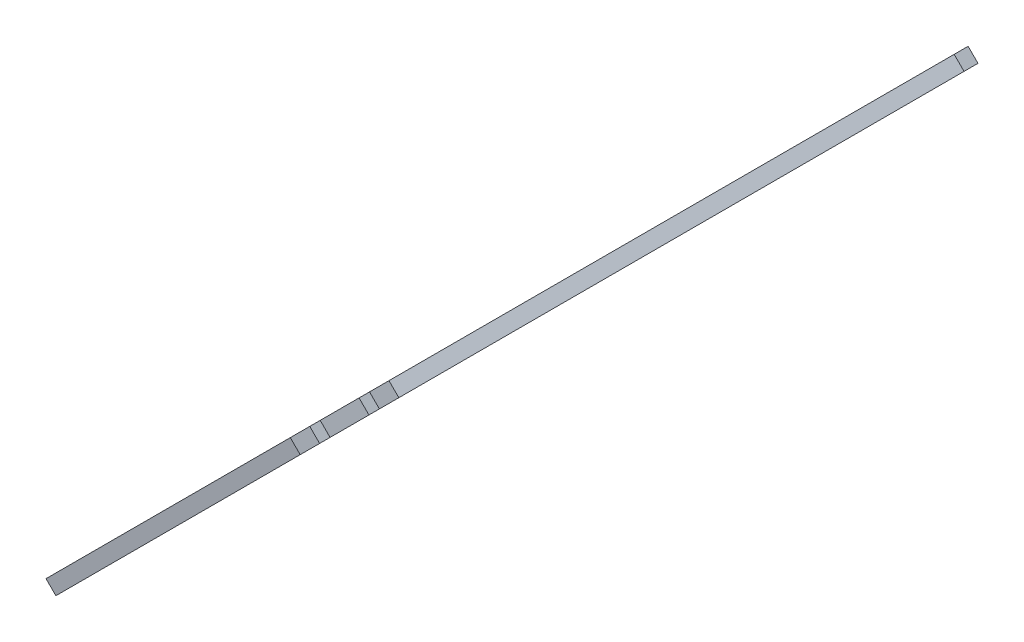
ISO-10303-21;
HEADER;
FILE_DESCRIPTION(('STEP AP214'),'2;1');
FILE_NAME('part.step','',(''),(''),'','','');
FILE_SCHEMA(('AUTOMOTIVE_DESIGN { 1 0 10303 214 1 1 1 1 }'));
ENDSEC;
DATA;
#1=APPLICATION_CONTEXT('core data for automotive mechanical design processes');
#2=APPLICATION_PROTOCOL_DEFINITION('international standard','automotive_design',2000,#1);
#3=PRODUCT_CONTEXT('',#1,'mechanical');
#4=PRODUCT('Part','Part','',(#3));
#5=PRODUCT_RELATED_PRODUCT_CATEGORY('part','',(#4));
#6=PRODUCT_DEFINITION_FORMATION('','',#4);
#7=PRODUCT_DEFINITION_CONTEXT('part definition',#1,'design');
#8=PRODUCT_DEFINITION('design','',#6,#7);
#9=PRODUCT_DEFINITION_SHAPE('','',#8);
#10=(LENGTH_UNIT() NAMED_UNIT(*) SI_UNIT(.MILLI.,.METRE.));
#11=(NAMED_UNIT(*) PLANE_ANGLE_UNIT() SI_UNIT($,.RADIAN.));
#12=(NAMED_UNIT(*) SI_UNIT($,.STERADIAN.) SOLID_ANGLE_UNIT());
#13=UNCERTAINTY_MEASURE_WITH_UNIT(LENGTH_MEASURE(1.E-05),#10,'distance_accuracy_value','');
#14=(GEOMETRIC_REPRESENTATION_CONTEXT(3) GLOBAL_UNCERTAINTY_ASSIGNED_CONTEXT((#13)) GLOBAL_UNIT_ASSIGNED_CONTEXT((#10,
#11,#12)) REPRESENTATION_CONTEXT('',''));
#15=CARTESIAN_POINT('',(0.,0.,0.));
#16=DIRECTION('',(0.,0.,1.));
#17=DIRECTION('',(1.,0.,0.));
#18=AXIS2_PLACEMENT_3D('',#15,#16,#17);
#19=CARTESIAN_POINT('',(-695.793434049919,954.082755931268,115.000000000005));
#20=DIRECTION('',(0.,0.,-1.));
#21=DIRECTION('',(0.,1.,0.));
#22=AXIS2_PLACEMENT_3D('',#19,#20,#21);
#23=PLANE('',#22);
#24=DIRECTION('',(-0.70710678118655,-0.707106781186545,0.));
#25=VECTOR('',#24,1.);
#26=CARTESIAN_POINT('',(-38.8908729652603,297.180194846605,115.000000000005));
#27=LINE('',#26,#25);
#28=CARTESIAN_POINT('',(10.3944696834426,346.465537495308,115.000000000005));
#29=VERTEX_POINT('',#28);
#30=CARTESIAN_POINT('',(-17.4655374953074,318.605530316558,115.000000000005));
#31=VERTEX_POINT('',#30);
#32=EDGE_CURVE('E284',#29,#31,#27,.T.);
#33=ORIENTED_EDGE('',*,*,#32,.T.);
#34=DIRECTION('',(-0.707106781186546,0.707106781186549,0.));
#35=VECTOR('',#34,1.);
#36=CARTESIAN_POINT('',(-17.4655374953074,318.605530316558,115.000000000005));
#37=LINE('',#36,#35);
#38=CARTESIAN_POINT('',(-10.3944696834423,311.534462504693,115.000000000005));
#39=VERTEX_POINT('',#38);
#40=EDGE_CURVE('E179',#39,#31,#37,.T.);
#41=ORIENTED_EDGE('',*,*,#40,.F.);
#42=DIRECTION('',(-0.70710678118655,-0.707106781186545,0.));
#43=VECTOR('',#42,1.);
#44=CARTESIAN_POINT('',(-31.8198051533949,290.10912703474,115.000000000005));
#45=LINE('',#44,#43);
#46=CARTESIAN_POINT('',(17.4655374953077,339.394469683442,115.000000000005));
#47=VERTEX_POINT('',#46);
#48=EDGE_CURVE('E265',#47,#39,#45,.T.);
#49=ORIENTED_EDGE('',*,*,#48,.F.);
#50=DIRECTION('',(0.707106781186545,-0.70710678118655,0.));
#51=VECTOR('',#50,1.);
#52=CARTESIAN_POINT('',(10.3944696834426,346.465537495308,115.000000000005));
#53=LINE('',#52,#51);
#54=EDGE_CURVE('E539',#29,#47,#53,.T.);
#55=ORIENTED_EDGE('',*,*,#54,.F.);
#56=EDGE_LOOP('',(#33,#41,#49,#55));
#57=FACE_BOUND('',#56,.T.);
#58=ADVANCED_FACE('F39',(#57),#23,.F.);
#59=CARTESIAN_POINT('',(31.8198051533949,367.89087296526,115.000000000005));
#60=VERTEX_POINT('',#59);
#61=CARTESIAN_POINT('',(17.88980156402,353.960869375885,115.000000000005));
#62=VERTEX_POINT('',#61);
#63=EDGE_CURVE('E277',#60,#62,#27,.T.);
#64=ORIENTED_EDGE('',*,*,#63,.T.);
#65=DIRECTION('',(-0.707106781186545,0.70710678118655,0.));
#66=VECTOR('',#65,1.);
#67=CARTESIAN_POINT('',(17.88980156402,353.960869375885,115.000000000005));
#68=LINE('',#67,#66);
#69=CARTESIAN_POINT('',(24.9608693758852,346.88980156402,115.000000000005));
#70=VERTEX_POINT('',#69);
#71=EDGE_CURVE('E194',#70,#62,#68,.T.);
#72=ORIENTED_EDGE('',*,*,#71,.F.);
#73=CARTESIAN_POINT('',(38.8908729652602,360.819805153394,115.000000000005));
#74=VERTEX_POINT('',#73);
#75=EDGE_CURVE('E261',#74,#70,#45,.T.);
#76=ORIENTED_EDGE('',*,*,#75,.F.);
#77=DIRECTION('',(0.707106781186545,-0.70710678118655,0.));
#78=VECTOR('',#77,1.);
#79=CARTESIAN_POINT('',(-625.082755931264,1024.79343404992,115.000000000005));
#80=LINE('',#79,#78);
#81=EDGE_CURVE('E271',#60,#74,#80,.T.);
#82=ORIENTED_EDGE('',*,*,#81,.F.);
#83=EDGE_LOOP('',(#64,#72,#76,#82));
#84=FACE_BOUND('',#83,.T.);
#85=ADVANCED_FACE('F384',(#84),#23,.F.);
#86=CARTESIAN_POINT('',(-334.973628896523,1314.90256108466,-10.0000000000012));
#87=DIRECTION('',(0.,0.,1.));
#88=DIRECTION('',(0.,-1.,0.));
#89=AXIS2_PLACEMENT_3D('',#86,#87,#88);
#90=PLANE('',#89);
#91=DIRECTION('',(0.70710678118655,0.707106781186545,0.));
#92=VECTOR('',#91,1.);
#93=CARTESIAN_POINT('',(321.928932188136,657.999999999999,-10.0000000000012));
#94=LINE('',#93,#92);
#95=CARTESIAN_POINT('',(-329.000000000001,7.07106781186628,-10.000000000001));
#96=VERTEX_POINT('',#95);
#97=CARTESIAN_POINT('',(-7.28319984622147,328.787867965644,-10.0000000000011));
#98=VERTEX_POINT('',#97);
#99=EDGE_CURVE('E353',#96,#98,#94,.T.);
#100=ORIENTED_EDGE('',*,*,#99,.T.);
#101=DIRECTION('',(-0.707106781186545,0.70710678118655,0.));
#102=VECTOR('',#101,1.);
#103=CARTESIAN_POINT('',(325.252334059711,-3.74766594028986,-10.000000000001));
#104=LINE('',#103,#102);
#105=CARTESIAN_POINT('',(-0.21213203435605,321.716800153779,-10.0000000000011));
#106=VERTEX_POINT('',#105);
#107=EDGE_CURVE('E220',#106,#98,#104,.T.);
#108=ORIENTED_EDGE('',*,*,#107,.F.);
#109=DIRECTION('',(0.70710678118655,0.707106781186545,0.));
#110=VECTOR('',#109,1.);
#111=CARTESIAN_POINT('',(329.000000000001,650.928932188134,-10.0000000000012));
#112=LINE('',#111,#110);
#113=CARTESIAN_POINT('',(-321.928932188136,8.32667268468867E-13,-10.000000000001));
#114=VERTEX_POINT('',#113);
#115=EDGE_CURVE('E251',#114,#106,#112,.T.);
#116=ORIENTED_EDGE('',*,*,#115,.F.);
#117=DIRECTION('',(0.707106781186545,-0.70710678118655,0.));
#118=VECTOR('',#117,1.);
#119=CARTESIAN_POINT('',(-985.90256108466,663.973628896529,-10.000000000001));
#120=LINE('',#119,#118);
#121=EDGE_CURVE('E324',#96,#114,#120,.T.);
#122=ORIENTED_EDGE('',*,*,#121,.F.);
#123=EDGE_LOOP('',(#100,#108,#116,#122));
#124=FACE_BOUND('',#123,.T.);
#125=ADVANCED_FACE('F364',(#124),#90,.F.);
#126=CARTESIAN_POINT('',(-17.8898015640197,304.039130624115,115.000000000005));
#127=VERTEX_POINT('',#126);
#128=CARTESIAN_POINT('',(-31.819805153395,290.10912703474,115.000000000005));
#129=VERTEX_POINT('',#128);
#130=EDGE_CURVE('E260',#127,#129,#45,.T.);
#131=ORIENTED_EDGE('',*,*,#130,.F.);
#132=DIRECTION('',(0.707106781186546,-0.707106781186549,0.));
#133=VECTOR('',#132,1.);
#134=CARTESIAN_POINT('',(-24.9608693758848,311.11019843598,115.000000000005));
#135=LINE('',#134,#133);
#136=CARTESIAN_POINT('',(-24.9608693758848,311.11019843598,115.000000000005));
#137=VERTEX_POINT('',#136);
#138=EDGE_CURVE('E210',#137,#127,#135,.T.);
#139=ORIENTED_EDGE('',*,*,#138,.F.);
#140=CARTESIAN_POINT('',(-38.8908729652603,297.180194846605,115.000000000005));
#141=VERTEX_POINT('',#140);
#142=EDGE_CURVE('E184',#137,#141,#27,.T.);
#143=ORIENTED_EDGE('',*,*,#142,.T.);
#144=DIRECTION('',(0.707106781186545,-0.70710678118655,0.));
#145=VECTOR('',#144,1.);
#146=CARTESIAN_POINT('',(-695.793434049919,954.082755931268,115.000000000005));
#147=LINE('',#146,#145);
#148=EDGE_CURVE('E315',#141,#129,#147,.T.);
#149=ORIENTED_EDGE('',*,*,#148,.T.);
#150=EDGE_LOOP('',(#131,#139,#143,#149));
#151=FACE_BOUND('',#150,.T.);
#152=ADVANCED_FACE('F316',(#151),#23,.F.);
#153=CARTESIAN_POINT('',(-985.90256108466,663.973628896529,-4.84926569304031E-13));
#154=DIRECTION('',(0.190845880010733,0.190845880010732,-0.962889246053698));
#155=DIRECTION('',(0.,0.98091851553698,0.194419304280023));
#156=AXIS2_PLACEMENT_3D('',#153,#154,#155);
#157=PLANE('',#156);
#158=ORIENTED_EDGE('',*,*,#148,.F.);
#159=DIRECTION('',(-0.680865515416174,-0.68086551541617,-0.269896831834206));
#160=VECTOR('',#159,1.);
#161=CARTESIAN_POINT('',(-329.000000000001,7.07106781186639,-4.45173583404306E-13));
#162=LINE('',#161,#160);
#163=CARTESIAN_POINT('',(-329.000000000002,7.07106781186628,-4.89289360674631E-13));
#164=VERTEX_POINT('',#163);
#165=EDGE_CURVE('E272',#141,#164,#162,.T.);
#166=ORIENTED_EDGE('',*,*,#165,.T.);
#167=DIRECTION('',(0.707106781186545,-0.70710678118655,0.));
#168=VECTOR('',#167,1.);
#169=CARTESIAN_POINT('',(-985.90256108466,663.973628896529,-4.84926569304031E-13));
#170=LINE('',#169,#168);
#171=CARTESIAN_POINT('',(-321.928932188136,8.32667268468867E-13,-4.89059638838123E-13));
#172=VERTEX_POINT('',#171);
#173=EDGE_CURVE('E318',#164,#172,#170,.T.);
#174=ORIENTED_EDGE('',*,*,#173,.T.);
#175=DIRECTION('',(-0.680865515416174,-0.68086551541617,-0.269896831834206));
#176=VECTOR('',#175,1.);
#177=CARTESIAN_POINT('',(-321.928932188136,8.32667268468867E-13,-5.07469850715723E-13));
#178=LINE('',#177,#176);
#179=EDGE_CURVE('E257',#129,#172,#178,.T.);
#180=ORIENTED_EDGE('',*,*,#179,.F.);
#181=EDGE_LOOP('',(#158,#166,#174,#180));
#182=FACE_BOUND('',#181,.T.);
#183=ADVANCED_FACE('F320',(#182),#157,.F.);
#184=CARTESIAN_POINT('',(-985.90256108466,663.973628896529,-10.000000000001));
#185=DIRECTION('',(0.70710678118655,0.707106781186545,0.));
#186=DIRECTION('',(-0.707106781186545,0.70710678118655,0.));
#187=AXIS2_PLACEMENT_3D('',#184,#185,#186);
#188=PLANE('',#187);
#189=ORIENTED_EDGE('',*,*,#173,.F.);
#190=DIRECTION('',(0.,0.,-1.));
#191=VECTOR('',#190,1.);
#192=CARTESIAN_POINT('',(-329.000000000001,7.07106781186628,-10.000000000001));
#193=LINE('',#192,#191);
#194=EDGE_CURVE('E276',#164,#96,#193,.T.);
#195=ORIENTED_EDGE('',*,*,#194,.T.);
#196=ORIENTED_EDGE('',*,*,#121,.T.);
#197=DIRECTION('',(0.,0.,-1.));
#198=VECTOR('',#197,1.);
#199=CARTESIAN_POINT('',(-321.928932188136,8.32667268468867E-13,-10.000000000001));
#200=LINE('',#199,#198);
#201=EDGE_CURVE('E254',#172,#114,#200,.T.);
#202=ORIENTED_EDGE('',*,*,#201,.F.);
#203=EDGE_LOOP('',(#189,#195,#196,#202));
#204=FACE_BOUND('',#203,.T.);
#205=ADVANCED_FACE('F362',(#204),#188,.F.);
#206=CARTESIAN_POINT('',(7.2831998462213,329.212132034356,-10.0000000000011));
#207=VERTEX_POINT('',#206);
#208=CARTESIAN_POINT('',(329.000000000001,650.928932188134,-10.0000000000012));
#209=VERTEX_POINT('',#208);
#210=EDGE_CURVE('E250',#207,#209,#112,.T.);
#211=ORIENTED_EDGE('',*,*,#210,.F.);
#212=DIRECTION('',(-0.707106781186545,0.70710678118655,0.));
#213=VECTOR('',#212,1.);
#214=CARTESIAN_POINT('',(332.747665940288,3.74766594028747,-10.000000000001));
#215=LINE('',#214,#213);
#216=CARTESIAN_POINT('',(0.212132034355908,336.283199846222,-10.0000000000011));
#217=VERTEX_POINT('',#216);
#218=EDGE_CURVE('E223',#207,#217,#215,.T.);
#219=ORIENTED_EDGE('',*,*,#218,.T.);
#220=CARTESIAN_POINT('',(321.928932188136,657.999999999999,-10.0000000000012));
#221=VERTEX_POINT('',#220);
#222=EDGE_CURVE('E356',#217,#221,#94,.T.);
#223=ORIENTED_EDGE('',*,*,#222,.T.);
#224=DIRECTION('',(0.707106781186545,-0.70710678118655,0.));
#225=VECTOR('',#224,1.);
#226=CARTESIAN_POINT('',(-334.973628896523,1314.90256108466,-10.0000000000012));
#227=LINE('',#226,#225);
#228=EDGE_CURVE('E326',#221,#209,#227,.T.);
#229=ORIENTED_EDGE('',*,*,#228,.T.);
#230=EDGE_LOOP('',(#211,#219,#223,#229));
#231=FACE_BOUND('',#230,.T.);
#232=ADVANCED_FACE('F375',(#231),#90,.F.);
#233=CARTESIAN_POINT('',(-334.973628896523,1314.90256108466,-1.18607136747062E-12));
#234=DIRECTION('',(-0.70710678118655,-0.707106781186545,0.));
#235=DIRECTION('',(0.707106781186545,-0.70710678118655,0.));
#236=AXIS2_PLACEMENT_3D('',#233,#234,#235);
#237=PLANE('',#236);
#238=ORIENTED_EDGE('',*,*,#228,.F.);
#239=DIRECTION('',(0.,0.,1.));
#240=VECTOR('',#239,1.);
#241=CARTESIAN_POINT('',(321.928932188136,657.999999999999,-1.17210332550212E-12));
#242=LINE('',#241,#240);
#243=CARTESIAN_POINT('',(321.928932188136,657.999999999999,-1.17210332550212E-12));
#244=VERTEX_POINT('',#243);
#245=EDGE_CURVE('E339',#221,#244,#242,.T.);
#246=ORIENTED_EDGE('',*,*,#245,.T.);
#247=DIRECTION('',(0.707106781186545,-0.70710678118655,0.));
#248=VECTOR('',#247,1.);
#249=CARTESIAN_POINT('',(-334.973628896523,1314.90256108466,-1.18607136747062E-12));
#250=LINE('',#249,#248);
#251=CARTESIAN_POINT('',(329.000000000001,650.928932188134,-1.19028381034744E-12));
#252=VERTEX_POINT('',#251);
#253=EDGE_CURVE('E285',#244,#252,#250,.T.);
#254=ORIENTED_EDGE('',*,*,#253,.T.);
#255=DIRECTION('',(0.,0.,1.));
#256=VECTOR('',#255,1.);
#257=CARTESIAN_POINT('',(329.000000000001,650.928932188134,-1.20861464888231E-12));
#258=LINE('',#257,#256);
#259=EDGE_CURVE('E268',#209,#252,#258,.T.);
#260=ORIENTED_EDGE('',*,*,#259,.F.);
#261=EDGE_LOOP('',(#238,#246,#254,#260));
#262=FACE_BOUND('',#261,.T.);
#263=ADVANCED_FACE('F337',(#262),#237,.F.);
#264=CARTESIAN_POINT('',(-625.082755931264,1024.79343404992,115.000000000005));
#265=DIRECTION('',(-0.190845880010734,-0.190845880010733,-0.962889246053697));
#266=DIRECTION('',(0.,0.980918515536979,-0.194419304280024));
#267=AXIS2_PLACEMENT_3D('',#264,#265,#266);
#268=PLANE('',#267);
#269=ORIENTED_EDGE('',*,*,#253,.F.);
#270=DIRECTION('',(-0.680865515416174,-0.680865515416169,0.269896831834208));
#271=VECTOR('',#270,1.);
#272=CARTESIAN_POINT('',(31.8198051533948,367.89087296526,115.000000000005));
#273=LINE('',#272,#271);
#274=EDGE_CURVE('E346',#244,#60,#273,.T.);
#275=ORIENTED_EDGE('',*,*,#274,.T.);
#276=ORIENTED_EDGE('',*,*,#81,.T.);
#277=DIRECTION('',(-0.680865515416174,-0.680865515416169,0.269896831834208));
#278=VECTOR('',#277,1.);
#279=CARTESIAN_POINT('',(38.8908729652601,360.819805153394,115.000000000005));
#280=LINE('',#279,#278);
#281=EDGE_CURVE('E264',#252,#74,#280,.T.);
#282=ORIENTED_EDGE('',*,*,#281,.F.);
#283=EDGE_LOOP('',(#269,#275,#276,#282));
#284=FACE_BOUND('',#283,.T.);
#285=ADVANCED_FACE('F41',(#284),#268,.F.);
#286=CARTESIAN_POINT('',(321.928932188136,657.999999999999,1170.5525240415));
#287=DIRECTION('',(0.707106781186545,-0.70710678118655,0.));
#288=DIRECTION('',(0.70710678118655,0.707106781186545,0.));
#289=AXIS2_PLACEMENT_3D('',#286,#287,#288);
#290=PLANE('',#289);
#291=DIRECTION('',(-0.707106781186549,-0.707106781186546,0.));
#292=VECTOR('',#291,1.);
#293=CARTESIAN_POINT('',(-24.9608693758848,311.11019843598,84.7000000000051));
#294=LINE('',#293,#292);
#295=CARTESIAN_POINT('',(-17.4655374953074,318.605530316558,84.7000000000051));
#296=VERTEX_POINT('',#295);
#297=CARTESIAN_POINT('',(-24.9608693758848,311.11019843598,84.7000000000051));
#298=VERTEX_POINT('',#297);
#299=EDGE_CURVE('E170',#296,#298,#294,.T.);
#300=ORIENTED_EDGE('',*,*,#299,.F.);
#301=DIRECTION('',(0.,0.,1.));
#302=VECTOR('',#301,1.);
#303=CARTESIAN_POINT('',(-17.4655374953074,318.605530316558,84.7000000000051));
#304=LINE('',#303,#302);
#305=EDGE_CURVE('E232',#296,#31,#304,.T.);
#306=ORIENTED_EDGE('',*,*,#305,.T.);
#307=ORIENTED_EDGE('',*,*,#32,.F.);
#308=DIRECTION('',(0.,0.,1.));
#309=VECTOR('',#308,1.);
#310=CARTESIAN_POINT('',(10.3944696834426,346.465537495308,84.7000000000051));
#311=LINE('',#310,#309);
#312=CARTESIAN_POINT('',(10.3944696834426,346.465537495308,84.7000000000051));
#313=VERTEX_POINT('',#312);
#314=EDGE_CURVE('E216',#313,#29,#311,.T.);
#315=ORIENTED_EDGE('',*,*,#314,.F.);
#316=DIRECTION('',(-0.707106781186549,-0.707106781186546,0.));
#317=VECTOR('',#316,1.);
#318=CARTESIAN_POINT('',(10.3944696834426,346.465537495308,84.7000000000051));
#319=LINE('',#318,#317);
#320=CARTESIAN_POINT('',(17.88980156402,353.960869375885,84.7000000000051));
#321=VERTEX_POINT('',#320);
#322=EDGE_CURVE('E191',#321,#313,#319,.T.);
#323=ORIENTED_EDGE('',*,*,#322,.F.);
#324=DIRECTION('',(0.,0.,1.));
#325=VECTOR('',#324,1.);
#326=CARTESIAN_POINT('',(17.88980156402,353.960869375885,84.7000000000051));
#327=LINE('',#326,#325);
#328=EDGE_CURVE('E205',#321,#62,#327,.T.);
#329=ORIENTED_EDGE('',*,*,#328,.T.);
#330=ORIENTED_EDGE('',*,*,#63,.F.);
#331=ORIENTED_EDGE('',*,*,#274,.F.);
#332=ORIENTED_EDGE('',*,*,#245,.F.);
#333=ORIENTED_EDGE('',*,*,#222,.F.);
#334=DIRECTION('',(0.00168894450032976,0.00168894450032977,0.999997147462406));
#335=VECTOR('',#334,1.);
#336=CARTESIAN_POINT('',(2.20784945546271,338.278917267328,1171.63250945084));
#337=LINE('',#336,#335);
#338=CARTESIAN_POINT('',(0.318198051533936,336.3892658634,52.7999999999989));
#339=VERTEX_POINT('',#338);
#340=EDGE_CURVE('E236',#217,#339,#337,.T.);
#341=ORIENTED_EDGE('',*,*,#340,.T.);
#342=DIRECTION('',(-0.70710678118655,-0.707106781186545,0.));
#343=VECTOR('',#342,1.);
#344=CARTESIAN_POINT('',(321.928932188135,657.999999999999,52.7999999999986));
#345=LINE('',#344,#343);
#346=CARTESIAN_POINT('',(-7.38926586339941,328.681801948466,52.7999999999989));
#347=VERTEX_POINT('',#346);
#348=EDGE_CURVE('E222',#339,#347,#345,.T.);
#349=ORIENTED_EDGE('',*,*,#348,.T.);
#350=DIRECTION('',(0.00168894450032956,0.00168894450032953,-0.999997147462407));
#351=VECTOR('',#350,1.);
#352=CARTESIAN_POINT('',(-9.27520367412499,326.795864137741,1169.43375004265));
#353=LINE('',#352,#351);
#354=EDGE_CURVE('E246',#347,#98,#353,.T.);
#355=ORIENTED_EDGE('',*,*,#354,.T.);
#356=ORIENTED_EDGE('',*,*,#99,.F.);
#357=ORIENTED_EDGE('',*,*,#194,.F.);
#358=ORIENTED_EDGE('',*,*,#165,.F.);
#359=ORIENTED_EDGE('',*,*,#142,.F.);
#360=DIRECTION('',(0.,0.,1.));
#361=VECTOR('',#360,1.);
#362=CARTESIAN_POINT('',(-24.9608693758848,311.11019843598,84.7000000000051));
#363=LINE('',#362,#361);
#364=EDGE_CURVE('E164',#298,#137,#363,.T.);
#365=ORIENTED_EDGE('',*,*,#364,.F.);
#366=EDGE_LOOP('',(#300,#306,#307,#315,#323,#329,#330,#331,#332,#333,#341,#349,#355,#356,#357,
#358,#359,#365));
#367=FACE_BOUND('',#366,.T.);
#368=ADVANCED_FACE('F182',(#367),#290,.F.);
#369=CARTESIAN_POINT('',(-321.928932188135,1.33226762955019E-12,1170.5525240415));
#370=DIRECTION('',(-0.707106781186545,0.70710678118655,0.));
#371=DIRECTION('',(-0.70710678118655,-0.707106781186545,0.));
#372=AXIS2_PLACEMENT_3D('',#369,#370,#371);
#373=PLANE('',#372);
#374=ORIENTED_EDGE('',*,*,#48,.T.);
#375=DIRECTION('',(0.,0.,1.));
#376=VECTOR('',#375,1.);
#377=CARTESIAN_POINT('',(-10.3944696834423,311.534462504693,84.7000000000051));
#378=LINE('',#377,#376);
#379=CARTESIAN_POINT('',(-10.3944696834423,311.534462504693,84.7000000000051));
#380=VERTEX_POINT('',#379);
#381=EDGE_CURVE('E185',#380,#39,#378,.T.);
#382=ORIENTED_EDGE('',*,*,#381,.F.);
#383=DIRECTION('',(0.70710678118655,0.707106781186546,0.));
#384=VECTOR('',#383,1.);
#385=CARTESIAN_POINT('',(-17.8898015640197,304.039130624115,84.7000000000051));
#386=LINE('',#385,#384);
#387=CARTESIAN_POINT('',(-17.8898015640196,304.039130624115,84.7000000000051));
#388=VERTEX_POINT('',#387);
#389=EDGE_CURVE('E169',#388,#380,#386,.T.);
#390=ORIENTED_EDGE('',*,*,#389,.F.);
#391=DIRECTION('',(0.,0.,1.));
#392=VECTOR('',#391,1.);
#393=CARTESIAN_POINT('',(-17.8898015640197,304.039130624115,84.7000000000051));
#394=LINE('',#393,#392);
#395=EDGE_CURVE('E167',#388,#127,#394,.T.);
#396=ORIENTED_EDGE('',*,*,#395,.T.);
#397=ORIENTED_EDGE('',*,*,#130,.T.);
#398=ORIENTED_EDGE('',*,*,#179,.T.);
#399=ORIENTED_EDGE('',*,*,#201,.T.);
#400=ORIENTED_EDGE('',*,*,#115,.T.);
#401=DIRECTION('',(-0.00168894450032956,-0.00168894450032953,0.999997147462407));
#402=VECTOR('',#401,1.);
#403=CARTESIAN_POINT('',(-2.20784945546254,319.721082732672,1171.63250945084));
#404=LINE('',#403,#402);
#405=CARTESIAN_POINT('',(-0.318198051534074,321.610734136601,52.799999999999));
#406=VERTEX_POINT('',#405);
#407=EDGE_CURVE('E12',#106,#406,#404,.T.);
#408=ORIENTED_EDGE('',*,*,#407,.T.);
#409=DIRECTION('',(0.70710678118655,0.707106781186545,0.));
#410=VECTOR('',#409,1.);
#411=CARTESIAN_POINT('',(-321.928932188136,8.1723752150988E-13,52.7999999999993));
#412=LINE('',#411,#410);
#413=CARTESIAN_POINT('',(7.38926586339936,329.318198051534,52.799999999999));
#414=VERTEX_POINT('',#413);
#415=EDGE_CURVE('E287',#406,#414,#412,.T.);
#416=ORIENTED_EDGE('',*,*,#415,.T.);
#417=DIRECTION('',(-0.00168894450032976,-0.00168894450032977,-0.999997147462406));
#418=VECTOR('',#417,1.);
#419=CARTESIAN_POINT('',(9.27520367412493,331.20413586226,1169.43375004265));
#420=LINE('',#419,#418);
#421=EDGE_CURVE('E47',#414,#207,#420,.T.);
#422=ORIENTED_EDGE('',*,*,#421,.T.);
#423=ORIENTED_EDGE('',*,*,#210,.T.);
#424=ORIENTED_EDGE('',*,*,#259,.T.);
#425=ORIENTED_EDGE('',*,*,#281,.T.);
#426=ORIENTED_EDGE('',*,*,#75,.T.);
#427=DIRECTION('',(0.,0.,1.));
#428=VECTOR('',#427,1.);
#429=CARTESIAN_POINT('',(24.9608693758852,346.88980156402,84.7000000000051));
#430=LINE('',#429,#428);
#431=CARTESIAN_POINT('',(24.9608693758852,346.88980156402,84.7000000000051));
#432=VERTEX_POINT('',#431);
#433=EDGE_CURVE('E211',#432,#70,#430,.T.);
#434=ORIENTED_EDGE('',*,*,#433,.F.);
#435=DIRECTION('',(0.707106781186549,0.707106781186546,0.));
#436=VECTOR('',#435,1.);
#437=CARTESIAN_POINT('',(17.4655374953077,339.394469683442,84.7000000000051));
#438=LINE('',#437,#436);
#439=CARTESIAN_POINT('',(17.4655374953079,339.394469683443,84.7000000000051));
#440=VERTEX_POINT('',#439);
#441=EDGE_CURVE('E541',#440,#432,#438,.T.);
#442=ORIENTED_EDGE('',*,*,#441,.F.);
#443=DIRECTION('',(0.,0.,1.));
#444=VECTOR('',#443,1.);
#445=CARTESIAN_POINT('',(17.4655374953077,339.394469683442,84.7000000000051));
#446=LINE('',#445,#444);
#447=EDGE_CURVE('E214',#440,#47,#446,.T.);
#448=ORIENTED_EDGE('',*,*,#447,.T.);
#449=EDGE_LOOP('',(#374,#382,#390,#396,#397,#398,#399,#400,#408,#416,#422,#423,#424,#425,#426,
#434,#442,#448));
#450=FACE_BOUND('',#449,.T.);
#451=ADVANCED_FACE('F307',(#450),#373,.F.);
#452=CARTESIAN_POINT('',(325.146268042533,-3.85373195746785,52.799999999999));
#453=DIRECTION('',(-0.707104764137874,-0.707104764137869,-0.0023885282184615));
#454=DIRECTION('',(0.707106781186545,-0.70710678118655,0.));
#455=AXIS2_PLACEMENT_3D('',#452,#453,#454);
#456=PLANE('',#455);
#457=DIRECTION('',(-0.707106781186545,0.70710678118655,0.));
#458=VECTOR('',#457,1.);
#459=CARTESIAN_POINT('',(325.146268042533,-3.85373195746785,52.799999999999));
#460=LINE('',#459,#458);
#461=EDGE_CURVE('E229',#406,#347,#460,.T.);
#462=ORIENTED_EDGE('',*,*,#461,.F.);
#463=ORIENTED_EDGE('',*,*,#407,.F.);
#464=ORIENTED_EDGE('',*,*,#107,.T.);
#465=ORIENTED_EDGE('',*,*,#354,.F.);
#466=EDGE_LOOP('',(#462,#463,#464,#465));
#467=FACE_BOUND('',#466,.T.);
#468=ADVANCED_FACE('F368',(#467),#456,.F.);
#469=CARTESIAN_POINT('',(332.853731957466,3.85373195746547,52.799999999999));
#470=DIRECTION('',(0.707104764137874,0.707104764137869,-0.00238852821846181));
#471=DIRECTION('',(-0.707106781186545,0.70710678118655,0.));
#472=AXIS2_PLACEMENT_3D('',#469,#470,#471);
#473=PLANE('',#472);
#474=ORIENTED_EDGE('',*,*,#218,.F.);
#475=ORIENTED_EDGE('',*,*,#421,.F.);
#476=DIRECTION('',(-0.707106781186545,0.70710678118655,0.));
#477=VECTOR('',#476,1.);
#478=CARTESIAN_POINT('',(332.853731957466,3.85373195746547,52.799999999999));
#479=LINE('',#478,#477);
#480=EDGE_CURVE('E226',#414,#339,#479,.T.);
#481=ORIENTED_EDGE('',*,*,#480,.T.);
#482=ORIENTED_EDGE('',*,*,#340,.F.);
#483=EDGE_LOOP('',(#474,#475,#481,#482));
#484=FACE_BOUND('',#483,.T.);
#485=ADVANCED_FACE('F373',(#484),#473,.F.);
#486=CARTESIAN_POINT('',(325.146268042533,-3.85373195746785,52.799999999999));
#487=DIRECTION('',(0.,0.,1.));
#488=DIRECTION('',(0.,-1.,0.));
#489=AXIS2_PLACEMENT_3D('',#486,#487,#488);
#490=PLANE('',#489);
#491=ORIENTED_EDGE('',*,*,#480,.F.);
#492=ORIENTED_EDGE('',*,*,#415,.F.);
#493=ORIENTED_EDGE('',*,*,#461,.T.);
#494=ORIENTED_EDGE('',*,*,#348,.F.);
#495=EDGE_LOOP('',(#491,#492,#493,#494));
#496=FACE_BOUND('',#495,.T.);
#497=ADVANCED_FACE('F370',(#496),#490,.F.);
#498=CARTESIAN_POINT('',(17.88980156402,353.960869375885,84.7000000000051));
#499=DIRECTION('',(0.70710678118655,0.707106781186545,0.));
#500=DIRECTION('',(-0.707106781186545,0.70710678118655,0.));
#501=AXIS2_PLACEMENT_3D('',#498,#499,#500);
#502=PLANE('',#501);
#503=ORIENTED_EDGE('',*,*,#71,.T.);
#504=ORIENTED_EDGE('',*,*,#328,.F.);
#505=DIRECTION('',(-0.707106781186545,0.70710678118655,0.));
#506=VECTOR('',#505,1.);
#507=CARTESIAN_POINT('',(17.88980156402,353.960869375885,84.7000000000051));
#508=LINE('',#507,#506);
#509=EDGE_CURVE('E219',#432,#321,#508,.T.);
#510=ORIENTED_EDGE('',*,*,#509,.F.);
#511=ORIENTED_EDGE('',*,*,#433,.T.);
#512=EDGE_LOOP('',(#503,#504,#510,#511));
#513=FACE_BOUND('',#512,.T.);
#514=ADVANCED_FACE('F454',(#513),#502,.F.);
#515=CARTESIAN_POINT('',(10.3944696834426,346.465537495308,84.7000000000051));
#516=DIRECTION('',(-0.70710678118655,-0.707106781186545,0.));
#517=DIRECTION('',(0.707106781186545,-0.70710678118655,0.));
#518=AXIS2_PLACEMENT_3D('',#515,#516,#517);
#519=PLANE('',#518);
#520=ORIENTED_EDGE('',*,*,#54,.T.);
#521=ORIENTED_EDGE('',*,*,#447,.F.);
#522=DIRECTION('',(0.707106781186545,-0.70710678118655,0.));
#523=VECTOR('',#522,1.);
#524=CARTESIAN_POINT('',(10.3944696834426,346.465537495308,84.7000000000051));
#525=LINE('',#524,#523);
#526=EDGE_CURVE('E62',#313,#440,#525,.T.);
#527=ORIENTED_EDGE('',*,*,#526,.F.);
#528=ORIENTED_EDGE('',*,*,#314,.T.);
#529=EDGE_LOOP('',(#520,#521,#527,#528));
#530=FACE_BOUND('',#529,.T.);
#531=ADVANCED_FACE('F488',(#530),#519,.F.);
#532=CARTESIAN_POINT('',(0.,0.,84.7000000000051));
#533=DIRECTION('',(0.,0.,-1.));
#534=DIRECTION('',(-1.,0.,0.));
#535=AXIS2_PLACEMENT_3D('',#532,#533,#534);
#536=PLANE('',#535);
#537=ORIENTED_EDGE('',*,*,#322,.T.);
#538=ORIENTED_EDGE('',*,*,#526,.T.);
#539=ORIENTED_EDGE('',*,*,#441,.T.);
#540=ORIENTED_EDGE('',*,*,#509,.T.);
#541=EDGE_LOOP('',(#537,#538,#539,#540));
#542=FACE_BOUND('',#541,.T.);
#543=ADVANCED_FACE('F498',(#542),#536,.F.);
#544=CARTESIAN_POINT('',(-17.4655374953074,318.605530316558,84.7000000000051));
#545=DIRECTION('',(0.707106781186549,0.707106781186546,0.));
#546=DIRECTION('',(-0.707106781186546,0.707106781186549,0.));
#547=AXIS2_PLACEMENT_3D('',#544,#545,#546);
#548=PLANE('',#547);
#549=ORIENTED_EDGE('',*,*,#40,.T.);
#550=ORIENTED_EDGE('',*,*,#305,.F.);
#551=DIRECTION('',(-0.707106781186546,0.707106781186549,0.));
#552=VECTOR('',#551,1.);
#553=CARTESIAN_POINT('',(-17.4655374953074,318.605530316558,84.7000000000051));
#554=LINE('',#553,#552);
#555=EDGE_CURVE('E176',#380,#296,#554,.T.);
#556=ORIENTED_EDGE('',*,*,#555,.F.);
#557=ORIENTED_EDGE('',*,*,#381,.T.);
#558=EDGE_LOOP('',(#549,#550,#556,#557));
#559=FACE_BOUND('',#558,.T.);
#560=ADVANCED_FACE('F299',(#559),#548,.F.);
#561=CARTESIAN_POINT('',(-24.9608693758848,311.11019843598,84.7000000000051));
#562=DIRECTION('',(-0.707106781186549,-0.707106781186546,0.));
#563=DIRECTION('',(0.707106781186546,-0.707106781186549,0.));
#564=AXIS2_PLACEMENT_3D('',#561,#562,#563);
#565=PLANE('',#564);
#566=ORIENTED_EDGE('',*,*,#138,.T.);
#567=ORIENTED_EDGE('',*,*,#395,.F.);
#568=DIRECTION('',(0.707106781186546,-0.707106781186549,0.));
#569=VECTOR('',#568,1.);
#570=CARTESIAN_POINT('',(-24.9608693758848,311.11019843598,84.7000000000051));
#571=LINE('',#570,#569);
#572=EDGE_CURVE('E54',#298,#388,#571,.T.);
#573=ORIENTED_EDGE('',*,*,#572,.F.);
#574=ORIENTED_EDGE('',*,*,#364,.T.);
#575=EDGE_LOOP('',(#566,#567,#573,#574));
#576=FACE_BOUND('',#575,.T.);
#577=ADVANCED_FACE('F162',(#576),#565,.F.);
#578=CARTESIAN_POINT('',(0.,0.,84.7000000000051));
#579=DIRECTION('',(0.,0.,-1.));
#580=DIRECTION('',(-1.,0.,0.));
#581=AXIS2_PLACEMENT_3D('',#578,#579,#580);
#582=PLANE('',#581);
#583=ORIENTED_EDGE('',*,*,#299,.T.);
#584=ORIENTED_EDGE('',*,*,#572,.T.);
#585=ORIENTED_EDGE('',*,*,#389,.T.);
#586=ORIENTED_EDGE('',*,*,#555,.T.);
#587=EDGE_LOOP('',(#583,#584,#585,#586));
#588=FACE_BOUND('',#587,.T.);
#589=ADVANCED_FACE('F174',(#588),#582,.F.);
#590=CLOSED_SHELL('',(#58,#85,#125,#152,#183,#205,#232,#263,#285,#368,#451,#468,#485,#497,#514,
#531,#543,#560,#577,#589));
#591=MANIFOLD_SOLID_BREP('B2',#590);
#592=ADVANCED_BREP_SHAPE_REPRESENTATION('',(#18,#591),#14);
#593=SHAPE_DEFINITION_REPRESENTATION(#9,#592);
ENDSEC;
END-ISO-10303-21;
